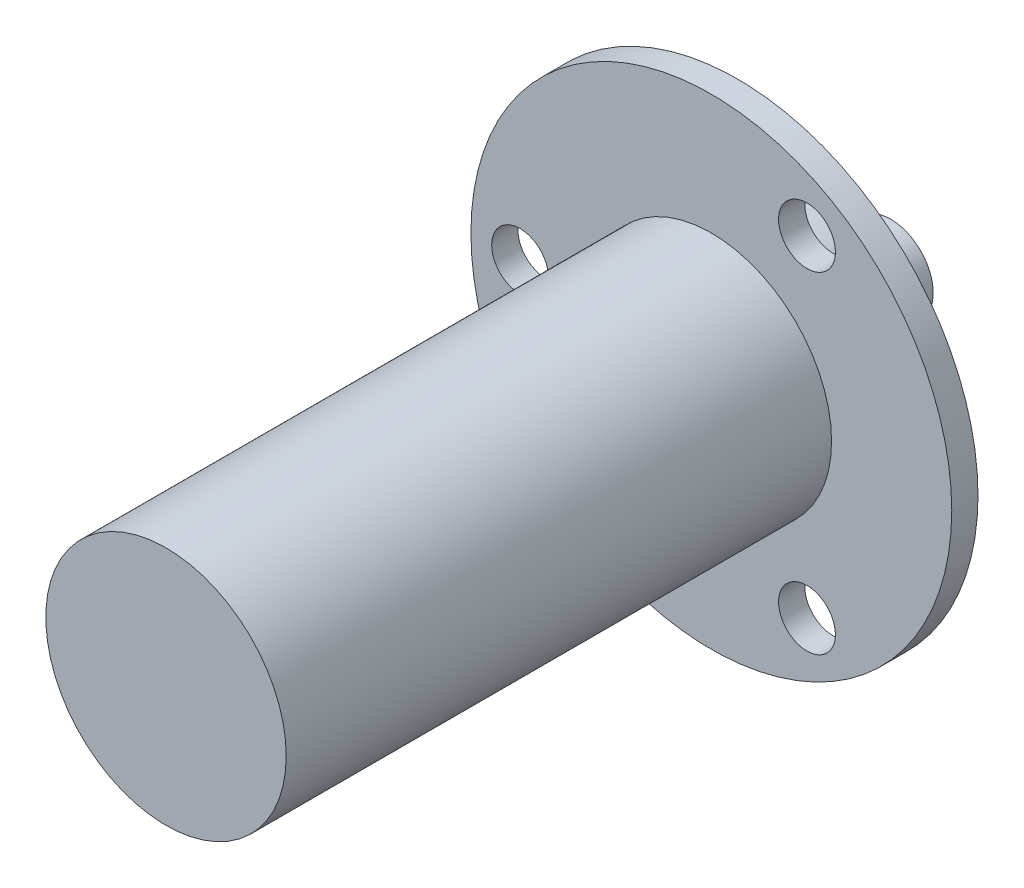
ISO-10303-21;
HEADER;
FILE_DESCRIPTION(('STEP AP214'),'2;1');
FILE_NAME('part.step','',(''),(''),'','','');
FILE_SCHEMA(('AUTOMOTIVE_DESIGN { 1 0 10303 214 1 1 1 1 }'));
ENDSEC;
DATA;
#1=APPLICATION_CONTEXT('core data for automotive mechanical design processes');
#2=APPLICATION_PROTOCOL_DEFINITION('international standard','automotive_design',2000,#1);
#3=PRODUCT_CONTEXT('',#1,'mechanical');
#4=PRODUCT('Part','Part','',(#3));
#5=PRODUCT_RELATED_PRODUCT_CATEGORY('part','',(#4));
#6=PRODUCT_DEFINITION_FORMATION('','',#4);
#7=PRODUCT_DEFINITION_CONTEXT('part definition',#1,'design');
#8=PRODUCT_DEFINITION('design','',#6,#7);
#9=PRODUCT_DEFINITION_SHAPE('','',#8);
#10=(LENGTH_UNIT() NAMED_UNIT(*) SI_UNIT(.MILLI.,.METRE.));
#11=(NAMED_UNIT(*) PLANE_ANGLE_UNIT() SI_UNIT($,.RADIAN.));
#12=(NAMED_UNIT(*) SI_UNIT($,.STERADIAN.) SOLID_ANGLE_UNIT());
#13=UNCERTAINTY_MEASURE_WITH_UNIT(LENGTH_MEASURE(1.E-05),#10,'distance_accuracy_value','');
#14=(GEOMETRIC_REPRESENTATION_CONTEXT(3) GLOBAL_UNCERTAINTY_ASSIGNED_CONTEXT((#13)) GLOBAL_UNIT_ASSIGNED_CONTEXT((#10,
#11,#12)) REPRESENTATION_CONTEXT('',''));
#15=CARTESIAN_POINT('',(0.,0.,0.));
#16=DIRECTION('',(0.,0.,1.));
#17=DIRECTION('',(1.,0.,0.));
#18=AXIS2_PLACEMENT_3D('',#15,#16,#17);
#19=CARTESIAN_POINT('',(0.,0.,49.9));
#20=DIRECTION('',(0.,0.,-1.));
#21=DIRECTION('',(-1.,0.,0.));
#22=AXIS2_PLACEMENT_3D('',#19,#20,#21);
#23=CYLINDRICAL_SURFACE('',#22,11.);
#24=CARTESIAN_POINT('',(0.,0.,49.9));
#25=DIRECTION('',(0.,0.,1.));
#26=DIRECTION('',(1.,0.,0.));
#27=AXIS2_PLACEMENT_3D('',#24,#25,#26);
#28=CIRCLE('',#27,11.);
#29=CARTESIAN_POINT('',(11.,0.,49.9));
#30=VERTEX_POINT('',#29);
#31=EDGE_CURVE('E45',#30,#30,#28,.T.);
#32=ORIENTED_EDGE('',*,*,#31,.F.);
#33=EDGE_LOOP('',(#32));
#34=FACE_BOUND('',#33,.T.);
#35=CARTESIAN_POINT('',(0.,0.,0.));
#36=DIRECTION('',(0.,0.,1.));
#37=DIRECTION('',(1.,0.,0.));
#38=AXIS2_PLACEMENT_3D('',#35,#36,#37);
#39=CIRCLE('',#38,11.);
#40=CARTESIAN_POINT('',(11.,0.,0.));
#41=VERTEX_POINT('',#40);
#42=EDGE_CURVE('E40',#41,#41,#39,.T.);
#43=ORIENTED_EDGE('',*,*,#42,.T.);
#44=EDGE_LOOP('',(#43));
#45=FACE_BOUND('',#44,.T.);
#46=ADVANCED_FACE('F37',(#34,#45),#23,.T.);
#47=CARTESIAN_POINT('',(0.,0.,49.9));
#48=DIRECTION('',(0.,0.,1.));
#49=DIRECTION('',(1.,0.,0.));
#50=AXIS2_PLACEMENT_3D('',#47,#48,#49);
#51=PLANE('',#50);
#52=ORIENTED_EDGE('',*,*,#31,.T.);
#53=EDGE_LOOP('',(#52));
#54=FACE_BOUND('',#53,.T.);
#55=ADVANCED_FACE('F126',(#54),#51,.T.);
#56=CARTESIAN_POINT('',(0.,0.,-2.4));
#57=DIRECTION('',(0.,0.,-1.));
#58=DIRECTION('',(-1.,0.,0.));
#59=AXIS2_PLACEMENT_3D('',#56,#57,#58);
#60=PLANE('',#59);
#61=CARTESIAN_POINT('',(0.,0.,-2.4));
#62=DIRECTION('',(0.,0.,-1.));
#63=DIRECTION('',(-1.,0.,0.));
#64=AXIS2_PLACEMENT_3D('',#61,#62,#63);
#65=CIRCLE('',#64,11.);
#66=CARTESIAN_POINT('',(-11.,0.,-2.4));
#67=VERTEX_POINT('',#66);
#68=EDGE_CURVE('E59',#67,#67,#65,.T.);
#69=ORIENTED_EDGE('',*,*,#68,.F.);
#70=EDGE_LOOP('',(#69));
#71=FACE_BOUND('',#70,.T.);
#72=CARTESIAN_POINT('',(8.75000000000007,-15.1554445662276,-2.4));
#73=DIRECTION('',(0.,0.,-1.));
#74=DIRECTION('',(-1.,0.,0.));
#75=AXIS2_PLACEMENT_3D('',#72,#73,#74);
#76=CIRCLE('',#75,2.6);
#77=CARTESIAN_POINT('',(6.15000000000007,-15.1554445662276,-2.4));
#78=VERTEX_POINT('',#77);
#79=EDGE_CURVE('E71',#78,#78,#76,.T.);
#80=ORIENTED_EDGE('',*,*,#79,.F.);
#81=EDGE_LOOP('',(#80));
#82=FACE_BOUND('',#81,.T.);
#83=CARTESIAN_POINT('',(0.,0.,-2.4));
#84=DIRECTION('',(0.,0.,-1.));
#85=DIRECTION('',(-1.,0.,0.));
#86=AXIS2_PLACEMENT_3D('',#83,#84,#85);
#87=CIRCLE('',#86,22.);
#88=CARTESIAN_POINT('',(-22.,0.,-2.4));
#89=VERTEX_POINT('',#88);
#90=EDGE_CURVE('E87',#89,#89,#87,.T.);
#91=ORIENTED_EDGE('',*,*,#90,.T.);
#92=EDGE_LOOP('',(#91));
#93=FACE_BOUND('',#92,.T.);
#94=CARTESIAN_POINT('',(-17.5,0.,-2.4));
#95=DIRECTION('',(0.,0.,-1.));
#96=DIRECTION('',(-1.,0.,0.));
#97=AXIS2_PLACEMENT_3D('',#94,#95,#96);
#98=CIRCLE('',#97,2.6);
#99=CARTESIAN_POINT('',(-20.1,0.,-2.4));
#100=VERTEX_POINT('',#99);
#101=EDGE_CURVE('E79',#100,#100,#98,.T.);
#102=ORIENTED_EDGE('',*,*,#101,.F.);
#103=EDGE_LOOP('',(#102));
#104=FACE_BOUND('',#103,.T.);
#105=CARTESIAN_POINT('',(8.74999999999986,15.1554445662278,-2.4));
#106=DIRECTION('',(0.,0.,-1.));
#107=DIRECTION('',(-1.,0.,0.));
#108=AXIS2_PLACEMENT_3D('',#105,#106,#107);
#109=CIRCLE('',#108,2.6);
#110=CARTESIAN_POINT('',(6.14999999999986,15.1554445662278,-2.4));
#111=VERTEX_POINT('',#110);
#112=EDGE_CURVE('E63',#111,#111,#109,.T.);
#113=ORIENTED_EDGE('',*,*,#112,.F.);
#114=EDGE_LOOP('',(#113));
#115=FACE_BOUND('',#114,.T.);
#116=ADVANCED_FACE('F100',(#71,#82,#93,#104,#115),#60,.T.);
#117=CARTESIAN_POINT('',(0.,0.,0.));
#118=DIRECTION('',(0.,0.,-1.));
#119=DIRECTION('',(-1.,0.,0.));
#120=AXIS2_PLACEMENT_3D('',#117,#118,#119);
#121=PLANE('',#120);
#122=ORIENTED_EDGE('',*,*,#42,.F.);
#123=EDGE_LOOP('',(#122));
#124=FACE_BOUND('',#123,.T.);
#125=CARTESIAN_POINT('',(0.,0.,0.));
#126=DIRECTION('',(0.,0.,-1.));
#127=DIRECTION('',(-1.,0.,0.));
#128=AXIS2_PLACEMENT_3D('',#125,#126,#127);
#129=CIRCLE('',#128,22.);
#130=CARTESIAN_POINT('',(-22.,0.,0.));
#131=VERTEX_POINT('',#130);
#132=EDGE_CURVE('E83',#131,#131,#129,.T.);
#133=ORIENTED_EDGE('',*,*,#132,.F.);
#134=EDGE_LOOP('',(#133));
#135=FACE_BOUND('',#134,.T.);
#136=CARTESIAN_POINT('',(-17.5,0.,0.));
#137=DIRECTION('',(0.,0.,-1.));
#138=DIRECTION('',(-1.,0.,0.));
#139=AXIS2_PLACEMENT_3D('',#136,#137,#138);
#140=CIRCLE('',#139,2.6);
#141=CARTESIAN_POINT('',(-20.1,0.,0.));
#142=VERTEX_POINT('',#141);
#143=EDGE_CURVE('E75',#142,#142,#140,.T.);
#144=ORIENTED_EDGE('',*,*,#143,.T.);
#145=EDGE_LOOP('',(#144));
#146=FACE_BOUND('',#145,.T.);
#147=CARTESIAN_POINT('',(8.75000000000007,-15.1554445662276,0.));
#148=DIRECTION('',(0.,0.,-1.));
#149=DIRECTION('',(-1.,0.,0.));
#150=AXIS2_PLACEMENT_3D('',#147,#148,#149);
#151=CIRCLE('',#150,2.6);
#152=CARTESIAN_POINT('',(6.15000000000007,-15.1554445662276,0.));
#153=VERTEX_POINT('',#152);
#154=EDGE_CURVE('E67',#153,#153,#151,.T.);
#155=ORIENTED_EDGE('',*,*,#154,.T.);
#156=EDGE_LOOP('',(#155));
#157=FACE_BOUND('',#156,.T.);
#158=CARTESIAN_POINT('',(8.74999999999986,15.1554445662278,0.));
#159=DIRECTION('',(0.,0.,-1.));
#160=DIRECTION('',(-1.,0.,0.));
#161=AXIS2_PLACEMENT_3D('',#158,#159,#160);
#162=CIRCLE('',#161,2.6);
#163=CARTESIAN_POINT('',(6.14999999999986,15.1554445662278,0.));
#164=VERTEX_POINT('',#163);
#165=EDGE_CURVE('E58',#164,#164,#162,.T.);
#166=ORIENTED_EDGE('',*,*,#165,.T.);
#167=EDGE_LOOP('',(#166));
#168=FACE_BOUND('',#167,.T.);
#169=ADVANCED_FACE('F97',(#124,#135,#146,#157,#168),#121,.F.);
#170=CARTESIAN_POINT('',(0.,0.,-2.4));
#171=DIRECTION('',(0.,0.,1.));
#172=DIRECTION('',(1.,0.,0.));
#173=AXIS2_PLACEMENT_3D('',#170,#171,#172);
#174=CYLINDRICAL_SURFACE('',#173,22.);
#175=ORIENTED_EDGE('',*,*,#90,.F.);
#176=EDGE_LOOP('',(#175));
#177=FACE_BOUND('',#176,.T.);
#178=ORIENTED_EDGE('',*,*,#132,.T.);
#179=EDGE_LOOP('',(#178));
#180=FACE_BOUND('',#179,.T.);
#181=ADVANCED_FACE('F95',(#177,#180),#174,.T.);
#182=CARTESIAN_POINT('',(-17.5,0.,-2.4));
#183=DIRECTION('',(0.,0.,1.));
#184=DIRECTION('',(1.,0.,0.));
#185=AXIS2_PLACEMENT_3D('',#182,#183,#184);
#186=CYLINDRICAL_SURFACE('',#185,2.6);
#187=ORIENTED_EDGE('',*,*,#101,.T.);
#188=EDGE_LOOP('',(#187));
#189=FACE_BOUND('',#188,.T.);
#190=ORIENTED_EDGE('',*,*,#143,.F.);
#191=EDGE_LOOP('',(#190));
#192=FACE_BOUND('',#191,.T.);
#193=ADVANCED_FACE('F122',(#189,#192),#186,.F.);
#194=CARTESIAN_POINT('',(8.75000000000007,-15.1554445662276,-2.4));
#195=DIRECTION('',(0.,0.,1.));
#196=DIRECTION('',(1.,0.,0.));
#197=AXIS2_PLACEMENT_3D('',#194,#195,#196);
#198=CYLINDRICAL_SURFACE('',#197,2.6);
#199=ORIENTED_EDGE('',*,*,#79,.T.);
#200=EDGE_LOOP('',(#199));
#201=FACE_BOUND('',#200,.T.);
#202=ORIENTED_EDGE('',*,*,#154,.F.);
#203=EDGE_LOOP('',(#202));
#204=FACE_BOUND('',#203,.T.);
#205=ADVANCED_FACE('F112',(#201,#204),#198,.F.);
#206=CARTESIAN_POINT('',(8.74999999999986,15.1554445662278,-2.4));
#207=DIRECTION('',(0.,0.,1.));
#208=DIRECTION('',(1.,0.,0.));
#209=AXIS2_PLACEMENT_3D('',#206,#207,#208);
#210=CYLINDRICAL_SURFACE('',#209,2.6);
#211=ORIENTED_EDGE('',*,*,#112,.T.);
#212=EDGE_LOOP('',(#211));
#213=FACE_BOUND('',#212,.T.);
#214=ORIENTED_EDGE('',*,*,#165,.F.);
#215=EDGE_LOOP('',(#214));
#216=FACE_BOUND('',#215,.T.);
#217=ADVANCED_FACE('F109',(#213,#216),#210,.F.);
#218=CARTESIAN_POINT('',(0.,0.,-7.4));
#219=DIRECTION('',(0.,0.,1.));
#220=DIRECTION('',(1.,0.,0.));
#221=AXIS2_PLACEMENT_3D('',#218,#219,#220);
#222=CYLINDRICAL_SURFACE('',#221,11.);
#223=CARTESIAN_POINT('',(0.,0.,-7.4));
#224=DIRECTION('',(0.,0.,-1.));
#225=DIRECTION('',(-1.,0.,0.));
#226=AXIS2_PLACEMENT_3D('',#223,#224,#225);
#227=CIRCLE('',#226,11.);
#228=CARTESIAN_POINT('',(-11.,0.,-7.4));
#229=VERTEX_POINT('',#228);
#230=EDGE_CURVE('E54',#229,#229,#227,.T.);
#231=ORIENTED_EDGE('',*,*,#230,.F.);
#232=EDGE_LOOP('',(#231));
#233=FACE_BOUND('',#232,.T.);
#234=ORIENTED_EDGE('',*,*,#68,.T.);
#235=EDGE_LOOP('',(#234));
#236=FACE_BOUND('',#235,.T.);
#237=ADVANCED_FACE('F111',(#233,#236),#222,.T.);
#238=CARTESIAN_POINT('',(0.,0.,-7.4));
#239=DIRECTION('',(0.,0.,-1.));
#240=DIRECTION('',(-1.,0.,0.));
#241=AXIS2_PLACEMENT_3D('',#238,#239,#240);
#242=PLANE('',#241);
#243=CARTESIAN_POINT('',(0.,0.,-7.4));
#244=DIRECTION('',(0.,0.,-1.));
#245=DIRECTION('',(-1.,0.,0.));
#246=AXIS2_PLACEMENT_3D('',#243,#244,#245);
#247=CIRCLE('',#246,3.9);
#248=CARTESIAN_POINT('',(-3.9,0.,-7.4));
#249=VERTEX_POINT('',#248);
#250=EDGE_CURVE('E10',#249,#249,#247,.T.);
#251=ORIENTED_EDGE('',*,*,#250,.F.);
#252=EDGE_LOOP('',(#251));
#253=FACE_BOUND('',#252,.T.);
#254=ORIENTED_EDGE('',*,*,#230,.T.);
#255=EDGE_LOOP('',(#254));
#256=FACE_BOUND('',#255,.T.);
#257=ADVANCED_FACE('F119',(#253,#256),#242,.T.);
#258=CARTESIAN_POINT('',(0.,0.,-16.4));
#259=DIRECTION('',(0.,0.,1.));
#260=DIRECTION('',(1.,0.,0.));
#261=AXIS2_PLACEMENT_3D('',#258,#259,#260);
#262=CYLINDRICAL_SURFACE('',#261,3.9);
#263=CARTESIAN_POINT('',(0.,0.,-16.4));
#264=DIRECTION('',(0.,0.,-1.));
#265=DIRECTION('',(-1.,0.,0.));
#266=AXIS2_PLACEMENT_3D('',#263,#264,#265);
#267=CIRCLE('',#266,3.9);
#268=CARTESIAN_POINT('',(-3.9,0.,-16.4));
#269=VERTEX_POINT('',#268);
#270=EDGE_CURVE('E53',#269,#269,#267,.T.);
#271=ORIENTED_EDGE('',*,*,#270,.F.);
#272=EDGE_LOOP('',(#271));
#273=FACE_BOUND('',#272,.T.);
#274=ORIENTED_EDGE('',*,*,#250,.T.);
#275=EDGE_LOOP('',(#274));
#276=FACE_BOUND('',#275,.T.);
#277=ADVANCED_FACE('F188',(#273,#276),#262,.T.);
#278=CARTESIAN_POINT('',(0.,0.,-16.4));
#279=DIRECTION('',(0.,0.,-1.));
#280=DIRECTION('',(-1.,0.,0.));
#281=AXIS2_PLACEMENT_3D('',#278,#279,#280);
#282=PLANE('',#281);
#283=ORIENTED_EDGE('',*,*,#270,.T.);
#284=EDGE_LOOP('',(#283));
#285=FACE_BOUND('',#284,.T.);
#286=ADVANCED_FACE('F198',(#285),#282,.T.);
#287=CLOSED_SHELL('',(#46,#55,#116,#169,#181,#193,#205,#217,#237,#257,#277,#286));
#288=MANIFOLD_SOLID_BREP('B2',#287);
#289=ADVANCED_BREP_SHAPE_REPRESENTATION('',(#18,#288),#14);
#290=SHAPE_DEFINITION_REPRESENTATION(#9,#289);
ENDSEC;
END-ISO-10303-21;
